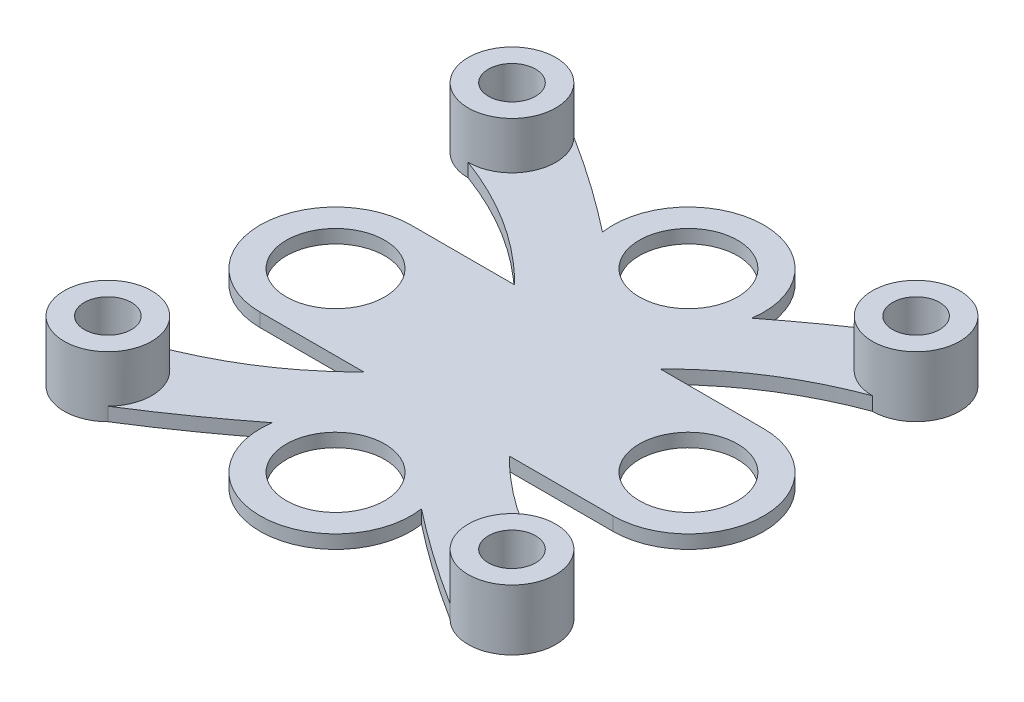
ISO-10303-21;
HEADER;
FILE_DESCRIPTION(('STEP AP214'),'2;1');
FILE_NAME('part.step','',(''),(''),'','','');
FILE_SCHEMA(('AUTOMOTIVE_DESIGN { 1 0 10303 214 1 1 1 1 }'));
ENDSEC;
DATA;
#1=APPLICATION_CONTEXT('core data for automotive mechanical design processes');
#2=APPLICATION_PROTOCOL_DEFINITION('international standard','automotive_design',2000,#1);
#3=PRODUCT_CONTEXT('',#1,'mechanical');
#4=PRODUCT('Part','Part','',(#3));
#5=PRODUCT_RELATED_PRODUCT_CATEGORY('part','',(#4));
#6=PRODUCT_DEFINITION_FORMATION('','',#4);
#7=PRODUCT_DEFINITION_CONTEXT('part definition',#1,'design');
#8=PRODUCT_DEFINITION('design','',#6,#7);
#9=PRODUCT_DEFINITION_SHAPE('','',#8);
#10=(LENGTH_UNIT() NAMED_UNIT(*) SI_UNIT(.MILLI.,.METRE.));
#11=(NAMED_UNIT(*) PLANE_ANGLE_UNIT() SI_UNIT($,.RADIAN.));
#12=(NAMED_UNIT(*) SI_UNIT($,.STERADIAN.) SOLID_ANGLE_UNIT());
#13=UNCERTAINTY_MEASURE_WITH_UNIT(LENGTH_MEASURE(1.E-05),#10,'distance_accuracy_value','');
#14=(GEOMETRIC_REPRESENTATION_CONTEXT(3) GLOBAL_UNCERTAINTY_ASSIGNED_CONTEXT((#13)) GLOBAL_UNIT_ASSIGNED_CONTEXT((#10,
#11,#12)) REPRESENTATION_CONTEXT('',''));
#15=CARTESIAN_POINT('',(0.,0.,0.));
#16=DIRECTION('',(0.,0.,1.));
#17=DIRECTION('',(1.,0.,0.));
#18=AXIS2_PLACEMENT_3D('',#15,#16,#17);
#19=CARTESIAN_POINT('',(0.,1.,0.));
#20=DIRECTION('',(0.,1.,0.));
#21=DIRECTION('',(0.,0.,1.));
#22=AXIS2_PLACEMENT_3D('',#19,#20,#21);
#23=PLANE('',#22);
#24=CARTESIAN_POINT('',(0.,1.,-13.1));
#25=DIRECTION('',(0.,1.,0.));
#26=DIRECTION('',(0.,0.,1.));
#27=AXIS2_PLACEMENT_3D('',#24,#25,#26);
#28=CIRCLE('',#27,3.65);
#29=CARTESIAN_POINT('',(0.,1.,-9.45));
#30=VERTEX_POINT('',#29);
#31=EDGE_CURVE('E420',#30,#30,#28,.T.);
#32=ORIENTED_EDGE('',*,*,#31,.F.);
#33=EDGE_LOOP('',(#32));
#34=FACE_BOUND('',#33,.T.);
#35=CARTESIAN_POINT('',(13.1,1.,0.));
#36=DIRECTION('',(0.,1.,0.));
#37=DIRECTION('',(0.,0.,1.));
#38=AXIS2_PLACEMENT_3D('',#35,#36,#37);
#39=CIRCLE('',#38,3.65);
#40=CARTESIAN_POINT('',(13.1,1.,3.65));
#41=VERTEX_POINT('',#40);
#42=EDGE_CURVE('E983',#41,#41,#39,.T.);
#43=ORIENTED_EDGE('',*,*,#42,.F.);
#44=EDGE_LOOP('',(#43));
#45=FACE_BOUND('',#44,.T.);
#46=CARTESIAN_POINT('',(-13.1,1.,0.));
#47=DIRECTION('',(0.,1.,0.));
#48=DIRECTION('',(0.,0.,1.));
#49=AXIS2_PLACEMENT_3D('',#46,#47,#48);
#50=CIRCLE('',#49,3.65);
#51=CARTESIAN_POINT('',(-13.1,1.,3.65));
#52=VERTEX_POINT('',#51);
#53=EDGE_CURVE('E985',#52,#52,#50,.F.);
#54=ORIENTED_EDGE('',*,*,#53,.T.);
#55=EDGE_LOOP('',(#54));
#56=FACE_BOUND('',#55,.T.);
#57=CARTESIAN_POINT('',(0.,1.,13.1));
#58=DIRECTION('',(0.,1.,0.));
#59=DIRECTION('',(0.,0.,1.));
#60=AXIS2_PLACEMENT_3D('',#57,#58,#59);
#61=CIRCLE('',#60,3.65);
#62=CARTESIAN_POINT('',(0.,1.,16.75));
#63=VERTEX_POINT('',#62);
#64=EDGE_CURVE('E206',#63,#63,#61,.F.);
#65=ORIENTED_EDGE('',*,*,#64,.T.);
#66=EDGE_LOOP('',(#65));
#67=FACE_BOUND('',#66,.T.);
#68=CARTESIAN_POINT('',(-15.,1.,11.75));
#69=CARTESIAN_POINT('',(-8.24080163232304,1.,9.24049933684202));
#70=CARTESIAN_POINT('',(-3.75,1.,3.75));
#71=B_SPLINE_CURVE_WITH_KNOTS('',2,(#68,#69,#70),.UNSPECIFIED.,.F.,.F.,(3,3),(0.,1.),.UNSPECIFIED.);
#72=CARTESIAN_POINT('',(-15.,1.,11.75));
#73=VERTEX_POINT('',#72);
#74=CARTESIAN_POINT('',(-5.4105688084127,1.,5.5999999999956));
#75=VERTEX_POINT('',#74);
#76=EDGE_CURVE('E192',#73,#75,#71,.T.);
#77=ORIENTED_EDGE('',*,*,#76,.F.);
#78=CARTESIAN_POINT('',(-15.,1.,15.));
#79=DIRECTION('',(0.,1.,0.));
#80=DIRECTION('',(0.,0.,-1.));
#81=AXIS2_PLACEMENT_3D('',#78,#79,#80);
#82=CIRCLE('',#81,3.25);
#83=CARTESIAN_POINT('',(-12.7019029611437,1.,17.2980970388563));
#84=VERTEX_POINT('',#83);
#85=EDGE_CURVE('E57',#84,#73,#82,.T.);
#86=ORIENTED_EDGE('',*,*,#85,.F.);
#87=CARTESIAN_POINT('',(-12.7019029611437,1.,17.2980970388563));
#88=CARTESIAN_POINT('',(-3.57208065136352,1.,11.5520674876467));
#89=CARTESIAN_POINT('',(3.75,1.,3.75));
#90=B_SPLINE_CURVE_WITH_KNOTS('',2,(#87,#88,#89),.UNSPECIFIED.,.F.,.F.,(3,3),(0.,1.),.UNSPECIFIED.);
#91=CARTESIAN_POINT('',(-5.53566012558322,1.,12.2535562782866));
#92=VERTEX_POINT('',#91);
#93=EDGE_CURVE('E135',#84,#92,#90,.T.);
#94=ORIENTED_EDGE('',*,*,#93,.T.);
#95=CARTESIAN_POINT('',(0.,1.,13.1));
#96=DIRECTION('',(0.,1.,0.));
#97=DIRECTION('',(0.,0.,1.));
#98=AXIS2_PLACEMENT_3D('',#95,#96,#97);
#99=CIRCLE('',#98,5.6);
#100=CARTESIAN_POINT('',(5.53566012558322,1.,12.2535562782866));
#101=VERTEX_POINT('',#100);
#102=EDGE_CURVE('E301',#101,#92,#99,.F.);
#103=ORIENTED_EDGE('',*,*,#102,.F.);
#104=CARTESIAN_POINT('',(12.7019029611437,1.,17.2980970388563));
#105=CARTESIAN_POINT('',(3.57208065136353,1.,11.5520674876467));
#106=CARTESIAN_POINT('',(-3.75,1.,3.75));
#107=B_SPLINE_CURVE_WITH_KNOTS('',2,(#104,#105,#106),.UNSPECIFIED.,.F.,.F.,(3,3),(0.,1.),.UNSPECIFIED.);
#108=CARTESIAN_POINT('',(12.7019029611437,1.,17.2980970388563));
#109=VERTEX_POINT('',#108);
#110=EDGE_CURVE('E434',#109,#101,#107,.T.);
#111=ORIENTED_EDGE('',*,*,#110,.F.);
#112=CARTESIAN_POINT('',(15.,1.,15.));
#113=DIRECTION('',(0.,1.,0.));
#114=DIRECTION('',(0.,0.,1.));
#115=AXIS2_PLACEMENT_3D('',#112,#113,#114);
#116=CIRCLE('',#115,3.25);
#117=CARTESIAN_POINT('',(15.,1.,11.75));
#118=VERTEX_POINT('',#117);
#119=EDGE_CURVE('E598',#118,#109,#116,.T.);
#120=ORIENTED_EDGE('',*,*,#119,.F.);
#121=CARTESIAN_POINT('',(15.,1.,11.75));
#122=CARTESIAN_POINT('',(8.24080163232304,1.,9.24049933684202));
#123=CARTESIAN_POINT('',(3.75,1.,3.75));
#124=B_SPLINE_CURVE_WITH_KNOTS('',2,(#121,#122,#123),.UNSPECIFIED.,.F.,.F.,(3,3),(0.,1.),.UNSPECIFIED.);
#125=CARTESIAN_POINT('',(5.4105688084127,1.,5.59999999999561));
#126=VERTEX_POINT('',#125);
#127=EDGE_CURVE('E461',#118,#126,#124,.T.);
#128=ORIENTED_EDGE('',*,*,#127,.T.);
#129=DIRECTION('',(-1.,0.,0.));
#130=VECTOR('',#129,1.);
#131=CARTESIAN_POINT('',(0.,1.,5.60000000000001));
#132=LINE('',#131,#130);
#133=CARTESIAN_POINT('',(13.1,1.,5.60000000000001));
#134=VERTEX_POINT('',#133);
#135=EDGE_CURVE('E469',#134,#126,#132,.T.);
#136=ORIENTED_EDGE('',*,*,#135,.F.);
#137=CARTESIAN_POINT('',(13.1,1.,0.));
#138=DIRECTION('',(0.,1.,0.));
#139=DIRECTION('',(0.,0.,1.));
#140=AXIS2_PLACEMENT_3D('',#137,#138,#139);
#141=CIRCLE('',#140,5.60000000000001);
#142=CARTESIAN_POINT('',(13.1,1.,-5.60000000000001));
#143=VERTEX_POINT('',#142);
#144=EDGE_CURVE('E952',#134,#143,#141,.T.);
#145=ORIENTED_EDGE('',*,*,#144,.T.);
#146=DIRECTION('',(-1.,0.,0.));
#147=VECTOR('',#146,1.);
#148=CARTESIAN_POINT('',(0.,1.,-5.6));
#149=LINE('',#148,#147);
#150=CARTESIAN_POINT('',(5.41056880841269,1.,-5.5999999999956));
#151=VERTEX_POINT('',#150);
#152=EDGE_CURVE('E505',#143,#151,#149,.T.);
#153=ORIENTED_EDGE('',*,*,#152,.T.);
#154=CARTESIAN_POINT('',(15.,1.,-11.75));
#155=CARTESIAN_POINT('',(8.24080163232304,1.,-9.24049933684202));
#156=CARTESIAN_POINT('',(3.75,1.,-3.75));
#157=B_SPLINE_CURVE_WITH_KNOTS('',2,(#154,#155,#156),.UNSPECIFIED.,.F.,.F.,(3,3),(0.,1.),.UNSPECIFIED.);
#158=CARTESIAN_POINT('',(15.,1.,-11.75));
#159=VERTEX_POINT('',#158);
#160=EDGE_CURVE('E497',#159,#151,#157,.T.);
#161=ORIENTED_EDGE('',*,*,#160,.F.);
#162=CARTESIAN_POINT('',(15.,1.,-15.));
#163=DIRECTION('',(0.,1.,0.));
#164=DIRECTION('',(0.,0.,-1.));
#165=AXIS2_PLACEMENT_3D('',#162,#163,#164);
#166=CIRCLE('',#165,3.25);
#167=CARTESIAN_POINT('',(12.7019029611437,1.,-17.2980970388563));
#168=VERTEX_POINT('',#167);
#169=EDGE_CURVE('E592',#168,#159,#166,.T.);
#170=ORIENTED_EDGE('',*,*,#169,.F.);
#171=CARTESIAN_POINT('',(12.7019029611437,1.,-17.2980970388563));
#172=CARTESIAN_POINT('',(3.57208065136352,1.,-11.5520674876467));
#173=CARTESIAN_POINT('',(-3.75,1.,-3.75));
#174=B_SPLINE_CURVE_WITH_KNOTS('',2,(#171,#172,#173),.UNSPECIFIED.,.F.,.F.,(3,3),(0.,1.),.UNSPECIFIED.);
#175=CARTESIAN_POINT('',(5.53566012558322,1.,-12.2535562782866));
#176=VERTEX_POINT('',#175);
#177=EDGE_CURVE('E504',#168,#176,#174,.T.);
#178=ORIENTED_EDGE('',*,*,#177,.T.);
#179=CARTESIAN_POINT('',(0.,1.,-13.1));
#180=DIRECTION('',(0.,1.,0.));
#181=DIRECTION('',(0.,0.,1.));
#182=AXIS2_PLACEMENT_3D('',#179,#180,#181);
#183=CIRCLE('',#182,5.6);
#184=CARTESIAN_POINT('',(-5.53566012558322,1.,-12.2535562782866));
#185=VERTEX_POINT('',#184);
#186=EDGE_CURVE('E512',#176,#185,#183,.T.);
#187=ORIENTED_EDGE('',*,*,#186,.T.);
#188=CARTESIAN_POINT('',(-12.7019029611437,1.,-17.2980970388563));
#189=CARTESIAN_POINT('',(-3.57208065136352,1.,-11.5520674876467));
#190=CARTESIAN_POINT('',(3.75,1.,-3.75));
#191=B_SPLINE_CURVE_WITH_KNOTS('',2,(#188,#189,#190),.UNSPECIFIED.,.F.,.F.,(3,3),(0.,1.),.UNSPECIFIED.);
#192=CARTESIAN_POINT('',(-12.7019029611437,1.,-17.2980970388563));
#193=VERTEX_POINT('',#192);
#194=EDGE_CURVE('E41',#193,#185,#191,.T.);
#195=ORIENTED_EDGE('',*,*,#194,.F.);
#196=CARTESIAN_POINT('',(-15.,1.,-15.));
#197=DIRECTION('',(0.,1.,0.));
#198=DIRECTION('',(0.,0.,1.));
#199=AXIS2_PLACEMENT_3D('',#196,#197,#198);
#200=CIRCLE('',#199,3.25);
#201=CARTESIAN_POINT('',(-15.,1.,-11.75));
#202=VERTEX_POINT('',#201);
#203=EDGE_CURVE('E440',#202,#193,#200,.T.);
#204=ORIENTED_EDGE('',*,*,#203,.F.);
#205=CARTESIAN_POINT('',(-15.,1.,-11.75));
#206=CARTESIAN_POINT('',(-8.24080163232304,1.,-9.24049933684202));
#207=CARTESIAN_POINT('',(-3.75,1.,-3.75));
#208=B_SPLINE_CURVE_WITH_KNOTS('',2,(#205,#206,#207),.UNSPECIFIED.,.F.,.F.,(3,3),(0.,1.),.UNSPECIFIED.);
#209=CARTESIAN_POINT('',(-5.4105688084127,1.,-5.5999999999956));
#210=VERTEX_POINT('',#209);
#211=EDGE_CURVE('E198',#202,#210,#208,.T.);
#212=ORIENTED_EDGE('',*,*,#211,.T.);
#213=DIRECTION('',(1.,0.,0.));
#214=VECTOR('',#213,1.);
#215=CARTESIAN_POINT('',(0.,1.,-5.6));
#216=LINE('',#215,#214);
#217=CARTESIAN_POINT('',(-13.1,1.,-5.60000000000001));
#218=VERTEX_POINT('',#217);
#219=EDGE_CURVE('E196',#218,#210,#216,.T.);
#220=ORIENTED_EDGE('',*,*,#219,.F.);
#221=CARTESIAN_POINT('',(-13.1,1.,0.));
#222=DIRECTION('',(0.,1.,0.));
#223=DIRECTION('',(0.,0.,1.));
#224=AXIS2_PLACEMENT_3D('',#221,#222,#223);
#225=CIRCLE('',#224,5.60000000000001);
#226=CARTESIAN_POINT('',(-13.1,1.,5.60000000000001));
#227=VERTEX_POINT('',#226);
#228=EDGE_CURVE('E182',#227,#218,#225,.F.);
#229=ORIENTED_EDGE('',*,*,#228,.F.);
#230=DIRECTION('',(1.,0.,0.));
#231=VECTOR('',#230,1.);
#232=CARTESIAN_POINT('',(0.,1.,5.6));
#233=LINE('',#232,#231);
#234=EDGE_CURVE('E189',#227,#75,#233,.T.);
#235=ORIENTED_EDGE('',*,*,#234,.T.);
#236=EDGE_LOOP('',(#77,#86,#94,#103,#111,#120,#128,#136,#145,#153,#161,#170,#178,#187,#195,#204,
#212,#220,#229,#235));
#237=FACE_BOUND('',#236,.T.);
#238=ADVANCED_FACE('F37',(#34,#45,#56,#67,#237),#23,.T.);
#239=CARTESIAN_POINT('',(-15.,1.,15.));
#240=DIRECTION('',(0.,-1.,0.));
#241=DIRECTION('',(0.,0.,-1.));
#242=AXIS2_PLACEMENT_3D('',#239,#240,#241);
#243=CYLINDRICAL_SURFACE('',#242,3.25);
#244=CARTESIAN_POINT('',(-15.,0.,15.));
#245=DIRECTION('',(0.,1.,0.));
#246=DIRECTION('',(0.,0.,1.));
#247=AXIS2_PLACEMENT_3D('',#244,#245,#246);
#248=CIRCLE('',#247,3.25);
#249=CARTESIAN_POINT('',(-12.7019029611437,0.,17.2980970388563));
#250=VERTEX_POINT('',#249);
#251=CARTESIAN_POINT('',(-15.,0.,11.75));
#252=VERTEX_POINT('',#251);
#253=EDGE_CURVE('E307',#250,#252,#248,.F.);
#254=ORIENTED_EDGE('',*,*,#253,.F.);
#255=DIRECTION('',(0.,-1.,0.));
#256=VECTOR('',#255,1.);
#257=CARTESIAN_POINT('',(-12.7019029611437,1.,17.2980970388563));
#258=LINE('',#257,#256);
#259=EDGE_CURVE('E12',#84,#250,#258,.T.);
#260=ORIENTED_EDGE('',*,*,#259,.F.);
#261=ORIENTED_EDGE('',*,*,#85,.T.);
#262=DIRECTION('',(0.,-1.,0.));
#263=VECTOR('',#262,1.);
#264=CARTESIAN_POINT('',(-15.,1.,11.75));
#265=LINE('',#264,#263);
#266=EDGE_CURVE('E127',#73,#252,#265,.T.);
#267=ORIENTED_EDGE('',*,*,#266,.T.);
#268=EDGE_LOOP('',(#254,#260,#261,#267));
#269=FACE_BOUND('',#268,.T.);
#270=CARTESIAN_POINT('',(-15.,4.5,15.));
#271=DIRECTION('',(0.,1.,0.));
#272=DIRECTION('',(0.,0.,1.));
#273=AXIS2_PLACEMENT_3D('',#270,#271,#272);
#274=CIRCLE('',#273,3.25);
#275=CARTESIAN_POINT('',(-15.,4.5,18.25));
#276=VERTEX_POINT('',#275);
#277=EDGE_CURVE('E429',#276,#276,#274,.T.);
#278=ORIENTED_EDGE('',*,*,#277,.F.);
#279=EDGE_LOOP('',(#278));
#280=FACE_BOUND('',#279,.T.);
#281=ADVANCED_FACE('F39',(#269,#280),#243,.T.);
#282=DIRECTION('',(0.,-1.,0.));
#283=VECTOR('',#282,1.);
#284=SURFACE_OF_LINEAR_EXTRUSION('',#90,#283);
#285=CARTESIAN_POINT('',(-12.7019029611437,0.,17.2980970388563));
#286=CARTESIAN_POINT('',(-3.57208065136352,0.,11.5520674876467));
#287=CARTESIAN_POINT('',(3.75,0.,3.75));
#288=B_SPLINE_CURVE_WITH_KNOTS('',2,(#285,#286,#287),.UNSPECIFIED.,.F.,.F.,(3,3),(0.,1.),.UNSPECIFIED.);
#289=CARTESIAN_POINT('',(-5.53566012558322,0.,12.2535562782866));
#290=VERTEX_POINT('',#289);
#291=EDGE_CURVE('E304',#250,#290,#288,.T.);
#292=ORIENTED_EDGE('',*,*,#291,.T.);
#293=DIRECTION('',(0.,-1.,0.));
#294=VECTOR('',#293,1.);
#295=CARTESIAN_POINT('',(-5.53566012558322,1.,12.2535562782866));
#296=LINE('',#295,#294);
#297=EDGE_CURVE('E48',#92,#290,#296,.T.);
#298=ORIENTED_EDGE('',*,*,#297,.F.);
#299=ORIENTED_EDGE('',*,*,#93,.F.);
#300=ORIENTED_EDGE('',*,*,#259,.T.);
#301=EDGE_LOOP('',(#292,#298,#299,#300));
#302=FACE_BOUND('',#301,.T.);
#303=ADVANCED_FACE('F305',(#302),#284,.F.);
#304=CARTESIAN_POINT('',(0.,1.,13.1));
#305=DIRECTION('',(0.,-1.,0.));
#306=DIRECTION('',(0.,0.,-1.));
#307=AXIS2_PLACEMENT_3D('',#304,#305,#306);
#308=CYLINDRICAL_SURFACE('',#307,5.6);
#309=CARTESIAN_POINT('',(0.,0.,13.1));
#310=DIRECTION('',(0.,1.,0.));
#311=DIRECTION('',(0.,0.,1.));
#312=AXIS2_PLACEMENT_3D('',#309,#310,#311);
#313=CIRCLE('',#312,5.6);
#314=CARTESIAN_POINT('',(5.53566012558322,0.,12.2535562782866));
#315=VERTEX_POINT('',#314);
#316=EDGE_CURVE('E299',#315,#290,#313,.F.);
#317=ORIENTED_EDGE('',*,*,#316,.F.);
#318=DIRECTION('',(0.,-1.,0.));
#319=VECTOR('',#318,1.);
#320=CARTESIAN_POINT('',(5.53566012558322,1.,12.2535562782866));
#321=LINE('',#320,#319);
#322=EDGE_CURVE('E291',#101,#315,#321,.T.);
#323=ORIENTED_EDGE('',*,*,#322,.F.);
#324=ORIENTED_EDGE('',*,*,#102,.T.);
#325=ORIENTED_EDGE('',*,*,#297,.T.);
#326=EDGE_LOOP('',(#317,#323,#324,#325));
#327=FACE_BOUND('',#326,.T.);
#328=ADVANCED_FACE('F297',(#327),#308,.T.);
#329=DIRECTION('',(0.,-1.,0.));
#330=VECTOR('',#329,1.);
#331=SURFACE_OF_LINEAR_EXTRUSION('',#107,#330);
#332=CARTESIAN_POINT('',(12.7019029611437,0.,17.2980970388563));
#333=CARTESIAN_POINT('',(3.57208065136353,0.,11.5520674876467));
#334=CARTESIAN_POINT('',(-3.75,0.,3.75));
#335=B_SPLINE_CURVE_WITH_KNOTS('',2,(#332,#333,#334),.UNSPECIFIED.,.F.,.F.,(3,3),(0.,1.),.UNSPECIFIED.);
#336=CARTESIAN_POINT('',(12.7019029611437,0.,17.2980970388563));
#337=VERTEX_POINT('',#336);
#338=EDGE_CURVE('E313',#337,#315,#335,.T.);
#339=ORIENTED_EDGE('',*,*,#338,.F.);
#340=DIRECTION('',(0.,-1.,0.));
#341=VECTOR('',#340,1.);
#342=CARTESIAN_POINT('',(12.7019029611437,1.,17.2980970388563));
#343=LINE('',#342,#341);
#344=EDGE_CURVE('E289',#109,#337,#343,.T.);
#345=ORIENTED_EDGE('',*,*,#344,.F.);
#346=ORIENTED_EDGE('',*,*,#110,.T.);
#347=ORIENTED_EDGE('',*,*,#322,.T.);
#348=EDGE_LOOP('',(#339,#345,#346,#347));
#349=FACE_BOUND('',#348,.T.);
#350=ADVANCED_FACE('F450',(#349),#331,.T.);
#351=CARTESIAN_POINT('',(15.,1.,15.));
#352=DIRECTION('',(0.,-1.,0.));
#353=DIRECTION('',(0.,0.,-1.));
#354=AXIS2_PLACEMENT_3D('',#351,#352,#353);
#355=CYLINDRICAL_SURFACE('',#354,3.25);
#356=CARTESIAN_POINT('',(15.,0.,15.));
#357=DIRECTION('',(0.,1.,0.));
#358=DIRECTION('',(0.,0.,1.));
#359=AXIS2_PLACEMENT_3D('',#356,#357,#358);
#360=CIRCLE('',#359,3.25);
#361=CARTESIAN_POINT('',(15.,0.,11.75));
#362=VERTEX_POINT('',#361);
#363=EDGE_CURVE('E315',#337,#362,#360,.T.);
#364=ORIENTED_EDGE('',*,*,#363,.T.);
#365=DIRECTION('',(0.,-1.,0.));
#366=VECTOR('',#365,1.);
#367=CARTESIAN_POINT('',(15.,1.,11.75));
#368=LINE('',#367,#366);
#369=EDGE_CURVE('E286',#118,#362,#368,.T.);
#370=ORIENTED_EDGE('',*,*,#369,.F.);
#371=ORIENTED_EDGE('',*,*,#119,.T.);
#372=ORIENTED_EDGE('',*,*,#344,.T.);
#373=EDGE_LOOP('',(#364,#370,#371,#372));
#374=FACE_BOUND('',#373,.T.);
#375=CARTESIAN_POINT('',(15.,4.5,15.));
#376=DIRECTION('',(0.,1.,0.));
#377=DIRECTION('',(0.,0.,1.));
#378=AXIS2_PLACEMENT_3D('',#375,#376,#377);
#379=CIRCLE('',#378,3.25);
#380=CARTESIAN_POINT('',(15.,4.5,18.25));
#381=VERTEX_POINT('',#380);
#382=EDGE_CURVE('E593',#381,#381,#379,.T.);
#383=ORIENTED_EDGE('',*,*,#382,.F.);
#384=EDGE_LOOP('',(#383));
#385=FACE_BOUND('',#384,.T.);
#386=ADVANCED_FACE('F453',(#374,#385),#355,.T.);
#387=DIRECTION('',(0.,-1.,0.));
#388=VECTOR('',#387,1.);
#389=SURFACE_OF_LINEAR_EXTRUSION('',#124,#388);
#390=CARTESIAN_POINT('',(15.,0.,11.75));
#391=CARTESIAN_POINT('',(8.24080163232304,0.,9.24049933684202));
#392=CARTESIAN_POINT('',(3.75,0.,3.75));
#393=B_SPLINE_CURVE_WITH_KNOTS('',2,(#390,#391,#392),.UNSPECIFIED.,.F.,.F.,(3,3),(0.,1.),.UNSPECIFIED.);
#394=CARTESIAN_POINT('',(5.4105688084127,0.,5.59999999999561));
#395=VERTEX_POINT('',#394);
#396=EDGE_CURVE('E327',#362,#395,#393,.T.);
#397=ORIENTED_EDGE('',*,*,#396,.T.);
#398=DIRECTION('',(0.,-1.,0.));
#399=VECTOR('',#398,1.);
#400=CARTESIAN_POINT('',(5.4105688084127,1.,5.59999999999561));
#401=LINE('',#400,#399);
#402=EDGE_CURVE('E284',#126,#395,#401,.T.);
#403=ORIENTED_EDGE('',*,*,#402,.F.);
#404=ORIENTED_EDGE('',*,*,#127,.F.);
#405=ORIENTED_EDGE('',*,*,#369,.T.);
#406=EDGE_LOOP('',(#397,#403,#404,#405));
#407=FACE_BOUND('',#406,.T.);
#408=ADVANCED_FACE('F474',(#407),#389,.F.);
#409=CARTESIAN_POINT('',(0.,1.,5.60000000000001));
#410=DIRECTION('',(0.,0.,1.));
#411=DIRECTION('',(1.,0.,0.));
#412=AXIS2_PLACEMENT_3D('',#409,#410,#411);
#413=PLANE('',#412);
#414=DIRECTION('',(-1.,0.,0.));
#415=VECTOR('',#414,1.);
#416=CARTESIAN_POINT('',(0.,0.,5.60000000000001));
#417=LINE('',#416,#415);
#418=CARTESIAN_POINT('',(13.1,0.,5.60000000000001));
#419=VERTEX_POINT('',#418);
#420=EDGE_CURVE('E332',#419,#395,#417,.T.);
#421=ORIENTED_EDGE('',*,*,#420,.F.);
#422=DIRECTION('',(0.,-1.,0.));
#423=VECTOR('',#422,1.);
#424=CARTESIAN_POINT('',(13.1,1.,5.60000000000001));
#425=LINE('',#424,#423);
#426=EDGE_CURVE('E282',#134,#419,#425,.T.);
#427=ORIENTED_EDGE('',*,*,#426,.F.);
#428=ORIENTED_EDGE('',*,*,#135,.T.);
#429=ORIENTED_EDGE('',*,*,#402,.T.);
#430=EDGE_LOOP('',(#421,#427,#428,#429));
#431=FACE_BOUND('',#430,.T.);
#432=ADVANCED_FACE('F477',(#431),#413,.T.);
#433=CARTESIAN_POINT('',(13.1,1.,0.));
#434=DIRECTION('',(0.,-1.,0.));
#435=DIRECTION('',(0.,0.,-1.));
#436=AXIS2_PLACEMENT_3D('',#433,#434,#435);
#437=CYLINDRICAL_SURFACE('',#436,5.60000000000001);
#438=CARTESIAN_POINT('',(13.1,0.,0.));
#439=DIRECTION('',(0.,1.,0.));
#440=DIRECTION('',(0.,0.,1.));
#441=AXIS2_PLACEMENT_3D('',#438,#439,#440);
#442=CIRCLE('',#441,5.60000000000001);
#443=CARTESIAN_POINT('',(13.1,0.,-5.60000000000001));
#444=VERTEX_POINT('',#443);
#445=EDGE_CURVE('E338',#419,#444,#442,.T.);
#446=ORIENTED_EDGE('',*,*,#445,.T.);
#447=DIRECTION('',(0.,-1.,0.));
#448=VECTOR('',#447,1.);
#449=CARTESIAN_POINT('',(13.1,1.,-5.60000000000001));
#450=LINE('',#449,#448);
#451=EDGE_CURVE('E279',#143,#444,#450,.T.);
#452=ORIENTED_EDGE('',*,*,#451,.F.);
#453=ORIENTED_EDGE('',*,*,#144,.F.);
#454=ORIENTED_EDGE('',*,*,#426,.T.);
#455=EDGE_LOOP('',(#446,#452,#453,#454));
#456=FACE_BOUND('',#455,.T.);
#457=ADVANCED_FACE('F481',(#456),#437,.T.);
#458=CARTESIAN_POINT('',(0.,1.,-5.6));
#459=DIRECTION('',(0.,0.,1.));
#460=DIRECTION('',(1.,0.,0.));
#461=AXIS2_PLACEMENT_3D('',#458,#459,#460);
#462=PLANE('',#461);
#463=DIRECTION('',(-1.,0.,0.));
#464=VECTOR('',#463,1.);
#465=CARTESIAN_POINT('',(0.,0.,-5.6));
#466=LINE('',#465,#464);
#467=CARTESIAN_POINT('',(5.41056880841269,0.,-5.5999999999956));
#468=VERTEX_POINT('',#467);
#469=EDGE_CURVE('E340',#444,#468,#466,.T.);
#470=ORIENTED_EDGE('',*,*,#469,.T.);
#471=DIRECTION('',(0.,-1.,0.));
#472=VECTOR('',#471,1.);
#473=CARTESIAN_POINT('',(5.41056880841269,1.,-5.5999999999956));
#474=LINE('',#473,#472);
#475=EDGE_CURVE('E277',#151,#468,#474,.T.);
#476=ORIENTED_EDGE('',*,*,#475,.F.);
#477=ORIENTED_EDGE('',*,*,#152,.F.);
#478=ORIENTED_EDGE('',*,*,#451,.T.);
#479=EDGE_LOOP('',(#470,#476,#477,#478));
#480=FACE_BOUND('',#479,.T.);
#481=ADVANCED_FACE('F485',(#480),#462,.F.);
#482=DIRECTION('',(0.,-1.,0.));
#483=VECTOR('',#482,1.);
#484=SURFACE_OF_LINEAR_EXTRUSION('',#157,#483);
#485=CARTESIAN_POINT('',(15.,0.,-11.75));
#486=CARTESIAN_POINT('',(8.24080163232304,0.,-9.24049933684202));
#487=CARTESIAN_POINT('',(3.75,0.,-3.75));
#488=B_SPLINE_CURVE_WITH_KNOTS('',2,(#485,#486,#487),.UNSPECIFIED.,.F.,.F.,(3,3),(0.,1.),.UNSPECIFIED.);
#489=CARTESIAN_POINT('',(15.,0.,-11.75));
#490=VERTEX_POINT('',#489);
#491=EDGE_CURVE('E343',#490,#468,#488,.T.);
#492=ORIENTED_EDGE('',*,*,#491,.F.);
#493=DIRECTION('',(0.,-1.,0.));
#494=VECTOR('',#493,1.);
#495=CARTESIAN_POINT('',(15.,1.,-11.75));
#496=LINE('',#495,#494);
#497=EDGE_CURVE('E275',#159,#490,#496,.T.);
#498=ORIENTED_EDGE('',*,*,#497,.F.);
#499=ORIENTED_EDGE('',*,*,#160,.T.);
#500=ORIENTED_EDGE('',*,*,#475,.T.);
#501=EDGE_LOOP('',(#492,#498,#499,#500));
#502=FACE_BOUND('',#501,.T.);
#503=ADVANCED_FACE('F489',(#502),#484,.T.);
#504=CARTESIAN_POINT('',(15.,1.,-15.));
#505=DIRECTION('',(0.,-1.,0.));
#506=DIRECTION('',(0.,0.,-1.));
#507=AXIS2_PLACEMENT_3D('',#504,#505,#506);
#508=CYLINDRICAL_SURFACE('',#507,3.25);
#509=CARTESIAN_POINT('',(15.,0.,-15.));
#510=DIRECTION('',(0.,1.,0.));
#511=DIRECTION('',(0.,0.,1.));
#512=AXIS2_PLACEMENT_3D('',#509,#510,#511);
#513=CIRCLE('',#512,3.25);
#514=CARTESIAN_POINT('',(12.7019029611437,0.,-17.2980970388563));
#515=VERTEX_POINT('',#514);
#516=EDGE_CURVE('E348',#515,#490,#513,.F.);
#517=ORIENTED_EDGE('',*,*,#516,.F.);
#518=DIRECTION('',(0.,-1.,0.));
#519=VECTOR('',#518,1.);
#520=CARTESIAN_POINT('',(12.7019029611437,1.,-17.2980970388563));
#521=LINE('',#520,#519);
#522=EDGE_CURVE('E269',#168,#515,#521,.T.);
#523=ORIENTED_EDGE('',*,*,#522,.F.);
#524=ORIENTED_EDGE('',*,*,#169,.T.);
#525=ORIENTED_EDGE('',*,*,#497,.T.);
#526=EDGE_LOOP('',(#517,#523,#524,#525));
#527=FACE_BOUND('',#526,.T.);
#528=CARTESIAN_POINT('',(15.,4.5,-15.));
#529=DIRECTION('',(0.,1.,0.));
#530=DIRECTION('',(0.,0.,1.));
#531=AXIS2_PLACEMENT_3D('',#528,#529,#530);
#532=CIRCLE('',#531,3.25);
#533=CARTESIAN_POINT('',(15.,4.5,-11.75));
#534=VERTEX_POINT('',#533);
#535=EDGE_CURVE('E595',#534,#534,#532,.T.);
#536=ORIENTED_EDGE('',*,*,#535,.F.);
#537=EDGE_LOOP('',(#536));
#538=FACE_BOUND('',#537,.T.);
#539=ADVANCED_FACE('F494',(#527,#538),#508,.T.);
#540=DIRECTION('',(0.,-1.,0.));
#541=VECTOR('',#540,1.);
#542=SURFACE_OF_LINEAR_EXTRUSION('',#174,#541);
#543=CARTESIAN_POINT('',(12.7019029611437,0.,-17.2980970388563));
#544=CARTESIAN_POINT('',(3.57208065136352,0.,-11.5520674876467));
#545=CARTESIAN_POINT('',(-3.75,0.,-3.75));
#546=B_SPLINE_CURVE_WITH_KNOTS('',2,(#543,#544,#545),.UNSPECIFIED.,.F.,.F.,(3,3),(0.,1.),.UNSPECIFIED.);
#547=CARTESIAN_POINT('',(5.53566012558322,0.,-12.2535562782866));
#548=VERTEX_POINT('',#547);
#549=EDGE_CURVE('E354',#515,#548,#546,.T.);
#550=ORIENTED_EDGE('',*,*,#549,.T.);
#551=DIRECTION('',(0.,-1.,0.));
#552=VECTOR('',#551,1.);
#553=CARTESIAN_POINT('',(5.53566012558322,1.,-12.2535562782866));
#554=LINE('',#553,#552);
#555=EDGE_CURVE('E261',#176,#548,#554,.T.);
#556=ORIENTED_EDGE('',*,*,#555,.F.);
#557=ORIENTED_EDGE('',*,*,#177,.F.);
#558=ORIENTED_EDGE('',*,*,#522,.T.);
#559=EDGE_LOOP('',(#550,#556,#557,#558));
#560=FACE_BOUND('',#559,.T.);
#561=ADVANCED_FACE('F516',(#560),#542,.F.);
#562=CARTESIAN_POINT('',(0.,1.,-13.1));
#563=DIRECTION('',(0.,-1.,0.));
#564=DIRECTION('',(0.,0.,-1.));
#565=AXIS2_PLACEMENT_3D('',#562,#563,#564);
#566=CYLINDRICAL_SURFACE('',#565,5.6);
#567=CARTESIAN_POINT('',(0.,0.,-13.1));
#568=DIRECTION('',(0.,1.,0.));
#569=DIRECTION('',(0.,0.,1.));
#570=AXIS2_PLACEMENT_3D('',#567,#568,#569);
#571=CIRCLE('',#570,5.6);
#572=CARTESIAN_POINT('',(-5.53566012558322,0.,-12.2535562782866));
#573=VERTEX_POINT('',#572);
#574=EDGE_CURVE('E358',#548,#573,#571,.T.);
#575=ORIENTED_EDGE('',*,*,#574,.T.);
#576=DIRECTION('',(0.,-1.,0.));
#577=VECTOR('',#576,1.);
#578=CARTESIAN_POINT('',(-5.53566012558322,1.,-12.2535562782866));
#579=LINE('',#578,#577);
#580=EDGE_CURVE('E256',#185,#573,#579,.T.);
#581=ORIENTED_EDGE('',*,*,#580,.F.);
#582=ORIENTED_EDGE('',*,*,#186,.F.);
#583=ORIENTED_EDGE('',*,*,#555,.T.);
#584=EDGE_LOOP('',(#575,#581,#582,#583));
#585=FACE_BOUND('',#584,.T.);
#586=ADVANCED_FACE('F519',(#585),#566,.T.);
#587=DIRECTION('',(0.,-1.,0.));
#588=VECTOR('',#587,1.);
#589=SURFACE_OF_LINEAR_EXTRUSION('',#191,#588);
#590=CARTESIAN_POINT('',(-12.7019029611437,0.,-17.2980970388563));
#591=CARTESIAN_POINT('',(-3.57208065136352,0.,-11.5520674876467));
#592=CARTESIAN_POINT('',(3.75,0.,-3.75));
#593=B_SPLINE_CURVE_WITH_KNOTS('',2,(#590,#591,#592),.UNSPECIFIED.,.F.,.F.,(3,3),(0.,1.),.UNSPECIFIED.);
#594=CARTESIAN_POINT('',(-12.7019029611437,0.,-17.2980970388563));
#595=VERTEX_POINT('',#594);
#596=EDGE_CURVE('E363',#595,#573,#593,.T.);
#597=ORIENTED_EDGE('',*,*,#596,.F.);
#598=DIRECTION('',(0.,-1.,0.));
#599=VECTOR('',#598,1.);
#600=CARTESIAN_POINT('',(-12.7019029611437,1.,-17.2980970388563));
#601=LINE('',#600,#599);
#602=EDGE_CURVE('E252',#193,#595,#601,.T.);
#603=ORIENTED_EDGE('',*,*,#602,.F.);
#604=ORIENTED_EDGE('',*,*,#194,.T.);
#605=ORIENTED_EDGE('',*,*,#580,.T.);
#606=EDGE_LOOP('',(#597,#603,#604,#605));
#607=FACE_BOUND('',#606,.T.);
#608=ADVANCED_FACE('F522',(#607),#589,.T.);
#609=CARTESIAN_POINT('',(-15.,1.,-15.));
#610=DIRECTION('',(0.,-1.,0.));
#611=DIRECTION('',(0.,0.,-1.));
#612=AXIS2_PLACEMENT_3D('',#609,#610,#611);
#613=CYLINDRICAL_SURFACE('',#612,3.25);
#614=CARTESIAN_POINT('',(-15.,0.,-15.));
#615=DIRECTION('',(0.,1.,0.));
#616=DIRECTION('',(0.,0.,1.));
#617=AXIS2_PLACEMENT_3D('',#614,#615,#616);
#618=CIRCLE('',#617,3.25);
#619=CARTESIAN_POINT('',(-15.,0.,-11.75));
#620=VERTEX_POINT('',#619);
#621=EDGE_CURVE('E368',#595,#620,#618,.T.);
#622=ORIENTED_EDGE('',*,*,#621,.T.);
#623=DIRECTION('',(0.,-1.,0.));
#624=VECTOR('',#623,1.);
#625=CARTESIAN_POINT('',(-15.,1.,-11.75));
#626=LINE('',#625,#624);
#627=EDGE_CURVE('E249',#202,#620,#626,.T.);
#628=ORIENTED_EDGE('',*,*,#627,.F.);
#629=ORIENTED_EDGE('',*,*,#203,.T.);
#630=ORIENTED_EDGE('',*,*,#602,.T.);
#631=EDGE_LOOP('',(#622,#628,#629,#630));
#632=FACE_BOUND('',#631,.T.);
#633=CARTESIAN_POINT('',(-15.,4.5,-15.));
#634=DIRECTION('',(0.,1.,0.));
#635=DIRECTION('',(0.,0.,1.));
#636=AXIS2_PLACEMENT_3D('',#633,#634,#635);
#637=CIRCLE('',#636,3.25);
#638=CARTESIAN_POINT('',(-15.,4.5,-11.75));
#639=VERTEX_POINT('',#638);
#640=EDGE_CURVE('E602',#639,#639,#637,.T.);
#641=ORIENTED_EDGE('',*,*,#640,.F.);
#642=EDGE_LOOP('',(#641));
#643=FACE_BOUND('',#642,.T.);
#644=ADVANCED_FACE('F231',(#632,#643),#613,.T.);
#645=DIRECTION('',(0.,-1.,0.));
#646=VECTOR('',#645,1.);
#647=SURFACE_OF_LINEAR_EXTRUSION('',#208,#646);
#648=CARTESIAN_POINT('',(-15.,0.,-11.75));
#649=CARTESIAN_POINT('',(-8.24080163232304,0.,-9.24049933684202));
#650=CARTESIAN_POINT('',(-3.75,0.,-3.75));
#651=B_SPLINE_CURVE_WITH_KNOTS('',2,(#648,#649,#650),.UNSPECIFIED.,.F.,.F.,(3,3),(0.,1.),.UNSPECIFIED.);
#652=CARTESIAN_POINT('',(-5.4105688084127,0.,-5.5999999999956));
#653=VERTEX_POINT('',#652);
#654=EDGE_CURVE('E373',#620,#653,#651,.T.);
#655=ORIENTED_EDGE('',*,*,#654,.T.);
#656=DIRECTION('',(0.,-1.,0.));
#657=VECTOR('',#656,1.);
#658=CARTESIAN_POINT('',(-5.4105688084127,1.,-5.5999999999956));
#659=LINE('',#658,#657);
#660=EDGE_CURVE('E253',#210,#653,#659,.T.);
#661=ORIENTED_EDGE('',*,*,#660,.F.);
#662=ORIENTED_EDGE('',*,*,#211,.F.);
#663=ORIENTED_EDGE('',*,*,#627,.T.);
#664=EDGE_LOOP('',(#655,#661,#662,#663));
#665=FACE_BOUND('',#664,.T.);
#666=ADVANCED_FACE('F227',(#665),#647,.F.);
#667=CARTESIAN_POINT('',(0.,1.,-5.6));
#668=DIRECTION('',(0.,0.,-1.));
#669=DIRECTION('',(-1.,0.,0.));
#670=AXIS2_PLACEMENT_3D('',#667,#668,#669);
#671=PLANE('',#670);
#672=DIRECTION('',(1.,0.,0.));
#673=VECTOR('',#672,1.);
#674=CARTESIAN_POINT('',(0.,0.,-5.6));
#675=LINE('',#674,#673);
#676=CARTESIAN_POINT('',(-13.1,0.,-5.60000000000001));
#677=VERTEX_POINT('',#676);
#678=EDGE_CURVE('E378',#677,#653,#675,.T.);
#679=ORIENTED_EDGE('',*,*,#678,.F.);
#680=DIRECTION('',(0.,-1.,0.));
#681=VECTOR('',#680,1.);
#682=CARTESIAN_POINT('',(-13.1,1.,-5.60000000000001));
#683=LINE('',#682,#681);
#684=EDGE_CURVE('E187',#218,#677,#683,.T.);
#685=ORIENTED_EDGE('',*,*,#684,.F.);
#686=ORIENTED_EDGE('',*,*,#219,.T.);
#687=ORIENTED_EDGE('',*,*,#660,.T.);
#688=EDGE_LOOP('',(#679,#685,#686,#687));
#689=FACE_BOUND('',#688,.T.);
#690=ADVANCED_FACE('F224',(#689),#671,.T.);
#691=CARTESIAN_POINT('',(-13.1,1.,0.));
#692=DIRECTION('',(0.,-1.,0.));
#693=DIRECTION('',(0.,0.,-1.));
#694=AXIS2_PLACEMENT_3D('',#691,#692,#693);
#695=CYLINDRICAL_SURFACE('',#694,5.60000000000001);
#696=CARTESIAN_POINT('',(-13.1,0.,0.));
#697=DIRECTION('',(0.,1.,0.));
#698=DIRECTION('',(0.,0.,1.));
#699=AXIS2_PLACEMENT_3D('',#696,#697,#698);
#700=CIRCLE('',#699,5.60000000000001);
#701=CARTESIAN_POINT('',(-13.1,0.,5.60000000000001));
#702=VERTEX_POINT('',#701);
#703=EDGE_CURVE('E184',#702,#677,#700,.F.);
#704=ORIENTED_EDGE('',*,*,#703,.F.);
#705=DIRECTION('',(0.,-1.,0.));
#706=VECTOR('',#705,1.);
#707=CARTESIAN_POINT('',(-13.1,1.,5.60000000000001));
#708=LINE('',#707,#706);
#709=EDGE_CURVE('E178',#227,#702,#708,.T.);
#710=ORIENTED_EDGE('',*,*,#709,.F.);
#711=ORIENTED_EDGE('',*,*,#228,.T.);
#712=ORIENTED_EDGE('',*,*,#684,.T.);
#713=EDGE_LOOP('',(#704,#710,#711,#712));
#714=FACE_BOUND('',#713,.T.);
#715=ADVANCED_FACE('F180',(#714),#695,.T.);
#716=CARTESIAN_POINT('',(0.,1.,5.6));
#717=DIRECTION('',(0.,0.,-1.));
#718=DIRECTION('',(-1.,0.,0.));
#719=AXIS2_PLACEMENT_3D('',#716,#717,#718);
#720=PLANE('',#719);
#721=DIRECTION('',(1.,0.,0.));
#722=VECTOR('',#721,1.);
#723=CARTESIAN_POINT('',(0.,0.,5.6));
#724=LINE('',#723,#722);
#725=CARTESIAN_POINT('',(-5.4105688084127,0.,5.5999999999956));
#726=VERTEX_POINT('',#725);
#727=EDGE_CURVE('E385',#702,#726,#724,.T.);
#728=ORIENTED_EDGE('',*,*,#727,.T.);
#729=DIRECTION('',(0.,-1.,0.));
#730=VECTOR('',#729,1.);
#731=CARTESIAN_POINT('',(-5.4105688084127,1.,5.5999999999956));
#732=LINE('',#731,#730);
#733=EDGE_CURVE('E123',#75,#726,#732,.T.);
#734=ORIENTED_EDGE('',*,*,#733,.F.);
#735=ORIENTED_EDGE('',*,*,#234,.F.);
#736=ORIENTED_EDGE('',*,*,#709,.T.);
#737=EDGE_LOOP('',(#728,#734,#735,#736));
#738=FACE_BOUND('',#737,.T.);
#739=ADVANCED_FACE('F190',(#738),#720,.F.);
#740=CARTESIAN_POINT('',(0.,1.,-13.1));
#741=DIRECTION('',(0.,-1.,0.));
#742=DIRECTION('',(0.,0.,-1.));
#743=AXIS2_PLACEMENT_3D('',#740,#741,#742);
#744=CYLINDRICAL_SURFACE('',#743,3.65);
#745=ORIENTED_EDGE('',*,*,#31,.T.);
#746=EDGE_LOOP('',(#745));
#747=FACE_BOUND('',#746,.T.);
#748=CARTESIAN_POINT('',(0.,0.,-13.1));
#749=DIRECTION('',(0.,1.,0.));
#750=DIRECTION('',(0.,0.,1.));
#751=AXIS2_PLACEMENT_3D('',#748,#749,#750);
#752=CIRCLE('',#751,3.65);
#753=CARTESIAN_POINT('',(0.,0.,-9.45));
#754=VERTEX_POINT('',#753);
#755=EDGE_CURVE('E413',#754,#754,#752,.T.);
#756=ORIENTED_EDGE('',*,*,#755,.F.);
#757=EDGE_LOOP('',(#756));
#758=FACE_BOUND('',#757,.T.);
#759=ADVANCED_FACE('F221',(#747,#758),#744,.F.);
#760=CARTESIAN_POINT('',(13.1,1.,0.));
#761=DIRECTION('',(0.,-1.,0.));
#762=DIRECTION('',(0.,0.,-1.));
#763=AXIS2_PLACEMENT_3D('',#760,#761,#762);
#764=CYLINDRICAL_SURFACE('',#763,3.65);
#765=ORIENTED_EDGE('',*,*,#42,.T.);
#766=EDGE_LOOP('',(#765));
#767=FACE_BOUND('',#766,.T.);
#768=CARTESIAN_POINT('',(13.1,0.,0.));
#769=DIRECTION('',(0.,1.,0.));
#770=DIRECTION('',(0.,0.,1.));
#771=AXIS2_PLACEMENT_3D('',#768,#769,#770);
#772=CIRCLE('',#771,3.65);
#773=CARTESIAN_POINT('',(13.1,0.,3.65));
#774=VERTEX_POINT('',#773);
#775=EDGE_CURVE('E410',#774,#774,#772,.T.);
#776=ORIENTED_EDGE('',*,*,#775,.F.);
#777=EDGE_LOOP('',(#776));
#778=FACE_BOUND('',#777,.T.);
#779=ADVANCED_FACE('F547',(#767,#778),#764,.F.);
#780=CARTESIAN_POINT('',(-15.,1.,-15.));
#781=DIRECTION('',(0.,-1.,0.));
#782=DIRECTION('',(0.,0.,-1.));
#783=AXIS2_PLACEMENT_3D('',#780,#781,#782);
#784=CYLINDRICAL_SURFACE('',#783,1.75);
#785=CARTESIAN_POINT('',(-15.,0.,-15.));
#786=DIRECTION('',(0.,1.,0.));
#787=DIRECTION('',(0.,0.,1.));
#788=AXIS2_PLACEMENT_3D('',#785,#786,#787);
#789=CIRCLE('',#788,1.75);
#790=CARTESIAN_POINT('',(-15.,0.,-13.25));
#791=VERTEX_POINT('',#790);
#792=EDGE_CURVE('E407',#791,#791,#789,.T.);
#793=ORIENTED_EDGE('',*,*,#792,.F.);
#794=EDGE_LOOP('',(#793));
#795=FACE_BOUND('',#794,.T.);
#796=CARTESIAN_POINT('',(-15.,4.5,-15.));
#797=DIRECTION('',(0.,1.,0.));
#798=DIRECTION('',(0.,0.,1.));
#799=AXIS2_PLACEMENT_3D('',#796,#797,#798);
#800=CIRCLE('',#799,1.75);
#801=CARTESIAN_POINT('',(-15.,4.5,-13.25));
#802=VERTEX_POINT('',#801);
#803=EDGE_CURVE('E604',#802,#802,#800,.T.);
#804=ORIENTED_EDGE('',*,*,#803,.T.);
#805=EDGE_LOOP('',(#804));
#806=FACE_BOUND('',#805,.T.);
#807=ADVANCED_FACE('F551',(#795,#806),#784,.F.);
#808=CARTESIAN_POINT('',(15.,1.,15.));
#809=DIRECTION('',(0.,-1.,0.));
#810=DIRECTION('',(0.,0.,-1.));
#811=AXIS2_PLACEMENT_3D('',#808,#809,#810);
#812=CYLINDRICAL_SURFACE('',#811,1.75);
#813=CARTESIAN_POINT('',(15.,0.,15.));
#814=DIRECTION('',(0.,1.,0.));
#815=DIRECTION('',(0.,0.,1.));
#816=AXIS2_PLACEMENT_3D('',#813,#814,#815);
#817=CIRCLE('',#816,1.75);
#818=CARTESIAN_POINT('',(15.,0.,16.75));
#819=VERTEX_POINT('',#818);
#820=EDGE_CURVE('E404',#819,#819,#817,.T.);
#821=ORIENTED_EDGE('',*,*,#820,.F.);
#822=EDGE_LOOP('',(#821));
#823=FACE_BOUND('',#822,.T.);
#824=CARTESIAN_POINT('',(15.,4.5,15.));
#825=DIRECTION('',(0.,1.,0.));
#826=DIRECTION('',(0.,0.,1.));
#827=AXIS2_PLACEMENT_3D('',#824,#825,#826);
#828=CIRCLE('',#827,1.75);
#829=CARTESIAN_POINT('',(15.,4.5,16.75));
#830=VERTEX_POINT('',#829);
#831=EDGE_CURVE('E612',#830,#830,#828,.T.);
#832=ORIENTED_EDGE('',*,*,#831,.T.);
#833=EDGE_LOOP('',(#832));
#834=FACE_BOUND('',#833,.T.);
#835=ADVANCED_FACE('F555',(#823,#834),#812,.F.);
#836=CARTESIAN_POINT('',(-13.1,1.,0.));
#837=DIRECTION('',(0.,-1.,0.));
#838=DIRECTION('',(0.,0.,-1.));
#839=AXIS2_PLACEMENT_3D('',#836,#837,#838);
#840=CYLINDRICAL_SURFACE('',#839,3.65);
#841=ORIENTED_EDGE('',*,*,#53,.F.);
#842=EDGE_LOOP('',(#841));
#843=FACE_BOUND('',#842,.T.);
#844=CARTESIAN_POINT('',(-13.1,0.,0.));
#845=DIRECTION('',(0.,1.,0.));
#846=DIRECTION('',(0.,0.,1.));
#847=AXIS2_PLACEMENT_3D('',#844,#845,#846);
#848=CIRCLE('',#847,3.65);
#849=CARTESIAN_POINT('',(-13.1,0.,3.65));
#850=VERTEX_POINT('',#849);
#851=EDGE_CURVE('E401',#850,#850,#848,.F.);
#852=ORIENTED_EDGE('',*,*,#851,.T.);
#853=EDGE_LOOP('',(#852));
#854=FACE_BOUND('',#853,.T.);
#855=ADVANCED_FACE('F559',(#843,#854),#840,.F.);
#856=CARTESIAN_POINT('',(0.,1.,13.1));
#857=DIRECTION('',(0.,-1.,0.));
#858=DIRECTION('',(0.,0.,-1.));
#859=AXIS2_PLACEMENT_3D('',#856,#857,#858);
#860=CYLINDRICAL_SURFACE('',#859,3.65);
#861=ORIENTED_EDGE('',*,*,#64,.F.);
#862=EDGE_LOOP('',(#861));
#863=FACE_BOUND('',#862,.T.);
#864=CARTESIAN_POINT('',(0.,0.,13.1));
#865=DIRECTION('',(0.,1.,0.));
#866=DIRECTION('',(0.,0.,1.));
#867=AXIS2_PLACEMENT_3D('',#864,#865,#866);
#868=CIRCLE('',#867,3.65);
#869=CARTESIAN_POINT('',(0.,0.,16.75));
#870=VERTEX_POINT('',#869);
#871=EDGE_CURVE('E398',#870,#870,#868,.F.);
#872=ORIENTED_EDGE('',*,*,#871,.T.);
#873=EDGE_LOOP('',(#872));
#874=FACE_BOUND('',#873,.T.);
#875=ADVANCED_FACE('F562',(#863,#874),#860,.F.);
#876=CARTESIAN_POINT('',(-15.,1.,15.));
#877=DIRECTION('',(0.,-1.,0.));
#878=DIRECTION('',(0.,0.,-1.));
#879=AXIS2_PLACEMENT_3D('',#876,#877,#878);
#880=CYLINDRICAL_SURFACE('',#879,1.75);
#881=CARTESIAN_POINT('',(-15.,0.,15.));
#882=DIRECTION('',(0.,1.,0.));
#883=DIRECTION('',(0.,0.,1.));
#884=AXIS2_PLACEMENT_3D('',#881,#882,#883);
#885=CIRCLE('',#884,1.75);
#886=CARTESIAN_POINT('',(-15.,0.,16.75));
#887=VERTEX_POINT('',#886);
#888=EDGE_CURVE('E392',#887,#887,#885,.F.);
#889=ORIENTED_EDGE('',*,*,#888,.T.);
#890=EDGE_LOOP('',(#889));
#891=FACE_BOUND('',#890,.T.);
#892=CARTESIAN_POINT('',(-15.,4.5,15.));
#893=DIRECTION('',(0.,1.,0.));
#894=DIRECTION('',(0.,0.,1.));
#895=AXIS2_PLACEMENT_3D('',#892,#893,#894);
#896=CIRCLE('',#895,1.75);
#897=CARTESIAN_POINT('',(-15.,4.5,16.75));
#898=VERTEX_POINT('',#897);
#899=EDGE_CURVE('E430',#898,#898,#896,.T.);
#900=ORIENTED_EDGE('',*,*,#899,.T.);
#901=EDGE_LOOP('',(#900));
#902=FACE_BOUND('',#901,.T.);
#903=ADVANCED_FACE('F217',(#891,#902),#880,.F.);
#904=DIRECTION('',(0.,-1.,0.));
#905=VECTOR('',#904,1.);
#906=SURFACE_OF_LINEAR_EXTRUSION('',#71,#905);
#907=CARTESIAN_POINT('',(-15.,0.,11.75));
#908=CARTESIAN_POINT('',(-8.24080163232304,0.,9.24049933684202));
#909=CARTESIAN_POINT('',(-3.75,0.,3.75));
#910=B_SPLINE_CURVE_WITH_KNOTS('',2,(#907,#908,#909),.UNSPECIFIED.,.F.,.F.,(3,3),(0.,1.),.UNSPECIFIED.);
#911=EDGE_CURVE('E387',#252,#726,#910,.T.);
#912=ORIENTED_EDGE('',*,*,#911,.F.);
#913=ORIENTED_EDGE('',*,*,#266,.F.);
#914=ORIENTED_EDGE('',*,*,#76,.T.);
#915=ORIENTED_EDGE('',*,*,#733,.T.);
#916=EDGE_LOOP('',(#912,#913,#914,#915));
#917=FACE_BOUND('',#916,.T.);
#918=ADVANCED_FACE('F212',(#917),#906,.T.);
#919=CARTESIAN_POINT('',(15.,1.,-15.));
#920=DIRECTION('',(0.,-1.,0.));
#921=DIRECTION('',(0.,0.,-1.));
#922=AXIS2_PLACEMENT_3D('',#919,#920,#921);
#923=CYLINDRICAL_SURFACE('',#922,1.75);
#924=CARTESIAN_POINT('',(15.,0.,-15.));
#925=DIRECTION('',(0.,1.,0.));
#926=DIRECTION('',(0.,0.,1.));
#927=AXIS2_PLACEMENT_3D('',#924,#925,#926);
#928=CIRCLE('',#927,1.75);
#929=CARTESIAN_POINT('',(15.,0.,-13.25));
#930=VERTEX_POINT('',#929);
#931=EDGE_CURVE('E416',#930,#930,#928,.F.);
#932=ORIENTED_EDGE('',*,*,#931,.T.);
#933=EDGE_LOOP('',(#932));
#934=FACE_BOUND('',#933,.T.);
#935=CARTESIAN_POINT('',(15.,4.5,-15.));
#936=DIRECTION('',(0.,1.,0.));
#937=DIRECTION('',(0.,0.,1.));
#938=AXIS2_PLACEMENT_3D('',#935,#936,#937);
#939=CIRCLE('',#938,1.75);
#940=CARTESIAN_POINT('',(15.,4.5,-13.25));
#941=VERTEX_POINT('',#940);
#942=EDGE_CURVE('E590',#941,#941,#939,.T.);
#943=ORIENTED_EDGE('',*,*,#942,.T.);
#944=EDGE_LOOP('',(#943));
#945=FACE_BOUND('',#944,.T.);
#946=ADVANCED_FACE('F216',(#934,#945),#923,.F.);
#947=CARTESIAN_POINT('',(0.,0.,0.));
#948=DIRECTION('',(0.,1.,0.));
#949=DIRECTION('',(0.,0.,1.));
#950=AXIS2_PLACEMENT_3D('',#947,#948,#949);
#951=PLANE('',#950);
#952=ORIENTED_EDGE('',*,*,#253,.T.);
#953=ORIENTED_EDGE('',*,*,#911,.T.);
#954=ORIENTED_EDGE('',*,*,#727,.F.);
#955=ORIENTED_EDGE('',*,*,#703,.T.);
#956=ORIENTED_EDGE('',*,*,#678,.T.);
#957=ORIENTED_EDGE('',*,*,#654,.F.);
#958=ORIENTED_EDGE('',*,*,#621,.F.);
#959=ORIENTED_EDGE('',*,*,#596,.T.);
#960=ORIENTED_EDGE('',*,*,#574,.F.);
#961=ORIENTED_EDGE('',*,*,#549,.F.);
#962=ORIENTED_EDGE('',*,*,#516,.T.);
#963=ORIENTED_EDGE('',*,*,#491,.T.);
#964=ORIENTED_EDGE('',*,*,#469,.F.);
#965=ORIENTED_EDGE('',*,*,#445,.F.);
#966=ORIENTED_EDGE('',*,*,#420,.T.);
#967=ORIENTED_EDGE('',*,*,#396,.F.);
#968=ORIENTED_EDGE('',*,*,#363,.F.);
#969=ORIENTED_EDGE('',*,*,#338,.T.);
#970=ORIENTED_EDGE('',*,*,#316,.T.);
#971=ORIENTED_EDGE('',*,*,#291,.F.);
#972=EDGE_LOOP('',(#952,#953,#954,#955,#956,#957,#958,#959,#960,#961,#962,#963,#964,#965,#966,
#967,#968,#969,#970,#971));
#973=FACE_BOUND('',#972,.T.);
#974=ORIENTED_EDGE('',*,*,#888,.F.);
#975=EDGE_LOOP('',(#974));
#976=FACE_BOUND('',#975,.T.);
#977=ORIENTED_EDGE('',*,*,#871,.F.);
#978=EDGE_LOOP('',(#977));
#979=FACE_BOUND('',#978,.T.);
#980=ORIENTED_EDGE('',*,*,#851,.F.);
#981=EDGE_LOOP('',(#980));
#982=FACE_BOUND('',#981,.T.);
#983=ORIENTED_EDGE('',*,*,#820,.T.);
#984=EDGE_LOOP('',(#983));
#985=FACE_BOUND('',#984,.T.);
#986=ORIENTED_EDGE('',*,*,#792,.T.);
#987=EDGE_LOOP('',(#986));
#988=FACE_BOUND('',#987,.T.);
#989=ORIENTED_EDGE('',*,*,#775,.T.);
#990=EDGE_LOOP('',(#989));
#991=FACE_BOUND('',#990,.T.);
#992=ORIENTED_EDGE('',*,*,#755,.T.);
#993=EDGE_LOOP('',(#992));
#994=FACE_BOUND('',#993,.T.);
#995=ORIENTED_EDGE('',*,*,#931,.F.);
#996=EDGE_LOOP('',(#995));
#997=FACE_BOUND('',#996,.T.);
#998=ADVANCED_FACE('F309',(#973,#976,#979,#982,#985,#988,#991,#994,#997),#951,.F.);
#999=CARTESIAN_POINT('',(0.,4.5,0.));
#1000=DIRECTION('',(0.,1.,0.));
#1001=DIRECTION('',(0.,0.,1.));
#1002=AXIS2_PLACEMENT_3D('',#999,#1000,#1001);
#1003=PLANE('',#1002);
#1004=ORIENTED_EDGE('',*,*,#803,.F.);
#1005=EDGE_LOOP('',(#1004));
#1006=FACE_BOUND('',#1005,.T.);
#1007=ORIENTED_EDGE('',*,*,#640,.T.);
#1008=EDGE_LOOP('',(#1007));
#1009=FACE_BOUND('',#1008,.T.);
#1010=ADVANCED_FACE('F538',(#1006,#1009),#1003,.T.);
#1011=CARTESIAN_POINT('',(0.,4.5,0.));
#1012=DIRECTION('',(0.,1.,0.));
#1013=DIRECTION('',(0.,0.,1.));
#1014=AXIS2_PLACEMENT_3D('',#1011,#1012,#1013);
#1015=PLANE('',#1014);
#1016=ORIENTED_EDGE('',*,*,#942,.F.);
#1017=EDGE_LOOP('',(#1016));
#1018=FACE_BOUND('',#1017,.T.);
#1019=ORIENTED_EDGE('',*,*,#535,.T.);
#1020=EDGE_LOOP('',(#1019));
#1021=FACE_BOUND('',#1020,.T.);
#1022=ADVANCED_FACE('F630',(#1018,#1021),#1015,.T.);
#1023=CARTESIAN_POINT('',(0.,4.5,0.));
#1024=DIRECTION('',(0.,1.,0.));
#1025=DIRECTION('',(0.,0.,1.));
#1026=AXIS2_PLACEMENT_3D('',#1023,#1024,#1025);
#1027=PLANE('',#1026);
#1028=ORIENTED_EDGE('',*,*,#831,.F.);
#1029=EDGE_LOOP('',(#1028));
#1030=FACE_BOUND('',#1029,.T.);
#1031=ORIENTED_EDGE('',*,*,#382,.T.);
#1032=EDGE_LOOP('',(#1031));
#1033=FACE_BOUND('',#1032,.T.);
#1034=ADVANCED_FACE('F624',(#1030,#1033),#1027,.T.);
#1035=CARTESIAN_POINT('',(0.,4.5,0.));
#1036=DIRECTION('',(0.,1.,0.));
#1037=DIRECTION('',(0.,0.,1.));
#1038=AXIS2_PLACEMENT_3D('',#1035,#1036,#1037);
#1039=PLANE('',#1038);
#1040=ORIENTED_EDGE('',*,*,#899,.F.);
#1041=EDGE_LOOP('',(#1040));
#1042=FACE_BOUND('',#1041,.T.);
#1043=ORIENTED_EDGE('',*,*,#277,.T.);
#1044=EDGE_LOOP('',(#1043));
#1045=FACE_BOUND('',#1044,.T.);
#1046=ADVANCED_FACE('F622',(#1042,#1045),#1039,.T.);
#1047=CLOSED_SHELL('',(#238,#281,#303,#328,#350,#386,#408,#432,#457,#481,#503,#539,#561,#586,
#608,#644,#666,#690,#715,#739,#759,#779,#807,#835,#855,#875,#903,#918,#946,#998,#1010,#1022,
#1034,#1046));
#1048=MANIFOLD_SOLID_BREP('B2',#1047);
#1049=ADVANCED_BREP_SHAPE_REPRESENTATION('',(#18,#1048),#14);
#1050=SHAPE_DEFINITION_REPRESENTATION(#9,#1049);
ENDSEC;
END-ISO-10303-21;
